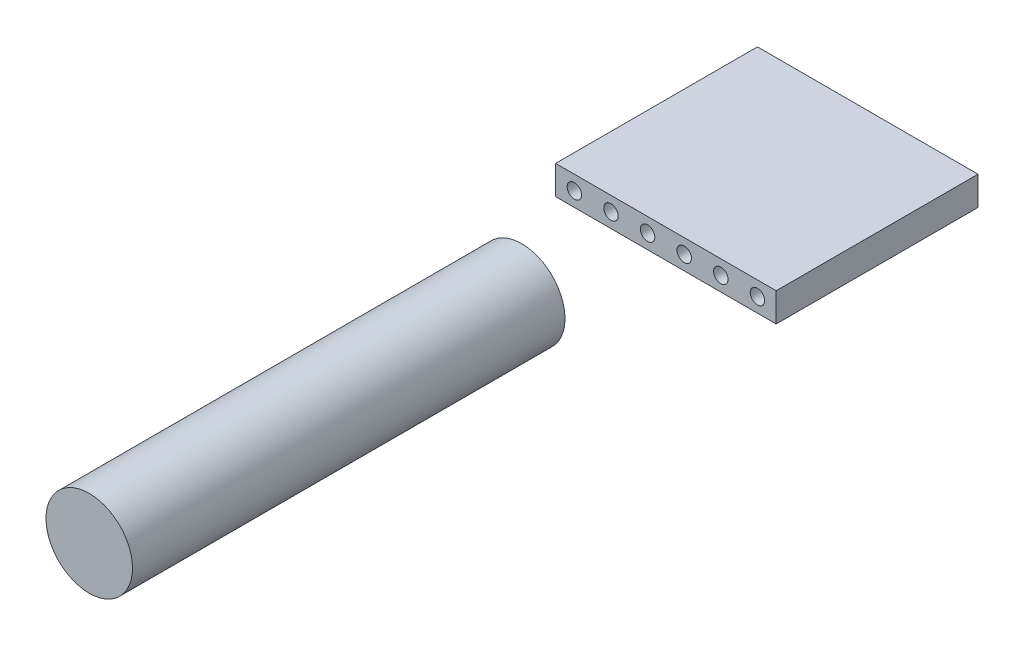
ISO-10303-21;
HEADER;
FILE_DESCRIPTION(('STEP AP214'),'2;1');
FILE_NAME('part.step','',(''),(''),'','','');
FILE_SCHEMA(('AUTOMOTIVE_DESIGN { 1 0 10303 214 1 1 1 1 }'));
ENDSEC;
DATA;
#1=APPLICATION_CONTEXT('core data for automotive mechanical design processes');
#2=APPLICATION_PROTOCOL_DEFINITION('international standard','automotive_design',2000,#1);
#3=PRODUCT_CONTEXT('',#1,'mechanical');
#4=PRODUCT('Part','Part','',(#3));
#5=PRODUCT_RELATED_PRODUCT_CATEGORY('part','',(#4));
#6=PRODUCT_DEFINITION_FORMATION('','',#4);
#7=PRODUCT_DEFINITION_CONTEXT('part definition',#1,'design');
#8=PRODUCT_DEFINITION('design','',#6,#7);
#9=PRODUCT_DEFINITION_SHAPE('','',#8);
#10=(LENGTH_UNIT() NAMED_UNIT(*) SI_UNIT(.MILLI.,.METRE.));
#11=(NAMED_UNIT(*) PLANE_ANGLE_UNIT() SI_UNIT($,.RADIAN.));
#12=(NAMED_UNIT(*) SI_UNIT($,.STERADIAN.) SOLID_ANGLE_UNIT());
#13=UNCERTAINTY_MEASURE_WITH_UNIT(LENGTH_MEASURE(1.E-05),#10,'distance_accuracy_value','');
#14=(GEOMETRIC_REPRESENTATION_CONTEXT(3) GLOBAL_UNCERTAINTY_ASSIGNED_CONTEXT((#13)) GLOBAL_UNIT_ASSIGNED_CONTEXT((#10,
#11,#12)) REPRESENTATION_CONTEXT('',''));
#15=CARTESIAN_POINT('',(0.,0.,0.));
#16=DIRECTION('',(0.,0.,1.));
#17=DIRECTION('',(1.,0.,0.));
#18=AXIS2_PLACEMENT_3D('',#15,#16,#17);
#19=CARTESIAN_POINT('',(0.,0.,14.));
#20=DIRECTION('',(0.,0.,1.));
#21=DIRECTION('',(1.,0.,0.));
#22=AXIS2_PLACEMENT_3D('',#19,#20,#21);
#23=PLANE('',#22);
#24=CARTESIAN_POINT('',(3.84,0.,14.));
#25=DIRECTION('',(0.,0.,1.));
#26=DIRECTION('',(1.,0.,0.));
#27=AXIS2_PLACEMENT_3D('',#24,#25,#26);
#28=CIRCLE('',#27,0.5);
#29=CARTESIAN_POINT('',(4.34,0.,14.));
#30=VERTEX_POINT('',#29);
#31=EDGE_CURVE('E123',#30,#30,#28,.T.);
#32=ORIENTED_EDGE('',*,*,#31,.F.);
#33=EDGE_LOOP('',(#32));
#34=FACE_BOUND('',#33,.T.);
#35=CARTESIAN_POINT('',(11.46,0.,14.));
#36=DIRECTION('',(0.,0.,1.));
#37=DIRECTION('',(1.,0.,0.));
#38=AXIS2_PLACEMENT_3D('',#35,#36,#37);
#39=CIRCLE('',#38,0.499999999999999);
#40=CARTESIAN_POINT('',(11.96,0.,14.));
#41=VERTEX_POINT('',#40);
#42=EDGE_CURVE('E129',#41,#41,#39,.T.);
#43=ORIENTED_EDGE('',*,*,#42,.F.);
#44=EDGE_LOOP('',(#43));
#45=FACE_BOUND('',#44,.T.);
#46=DIRECTION('',(-1.,0.,0.));
#47=VECTOR('',#46,1.);
#48=CARTESIAN_POINT('',(0.,1.,14.));
#49=LINE('',#48,#47);
#50=CARTESIAN_POINT('',(15.3,1.,14.));
#51=VERTEX_POINT('',#50);
#52=CARTESIAN_POINT('',(0.,1.,14.));
#53=VERTEX_POINT('',#52);
#54=EDGE_CURVE('E95',#51,#53,#49,.T.);
#55=ORIENTED_EDGE('',*,*,#54,.T.);
#56=DIRECTION('',(0.,-1.,0.));
#57=VECTOR('',#56,1.);
#58=CARTESIAN_POINT('',(0.,1.,14.));
#59=LINE('',#58,#57);
#60=CARTESIAN_POINT('',(0.,-1.,14.));
#61=VERTEX_POINT('',#60);
#62=EDGE_CURVE('E91',#53,#61,#59,.T.);
#63=ORIENTED_EDGE('',*,*,#62,.T.);
#64=DIRECTION('',(1.,0.,0.));
#65=VECTOR('',#64,1.);
#66=CARTESIAN_POINT('',(0.,-1.,14.));
#67=LINE('',#66,#65);
#68=CARTESIAN_POINT('',(15.3,-1.,14.));
#69=VERTEX_POINT('',#68);
#70=EDGE_CURVE('E84',#61,#69,#67,.T.);
#71=ORIENTED_EDGE('',*,*,#70,.T.);
#72=DIRECTION('',(0.,1.,0.));
#73=VECTOR('',#72,1.);
#74=CARTESIAN_POINT('',(15.3,1.,14.));
#75=LINE('',#74,#73);
#76=EDGE_CURVE('E88',#69,#51,#75,.T.);
#77=ORIENTED_EDGE('',*,*,#76,.T.);
#78=EDGE_LOOP('',(#55,#63,#71,#77));
#79=FACE_BOUND('',#78,.T.);
#80=CARTESIAN_POINT('',(8.92,0.,14.));
#81=DIRECTION('',(0.,0.,-1.));
#82=DIRECTION('',(-1.,0.,0.));
#83=AXIS2_PLACEMENT_3D('',#80,#81,#82);
#84=CIRCLE('',#83,0.499999999999999);
#85=CARTESIAN_POINT('',(8.42,0.,14.));
#86=VERTEX_POINT('',#85);
#87=EDGE_CURVE('E49',#86,#86,#84,.T.);
#88=ORIENTED_EDGE('',*,*,#87,.T.);
#89=EDGE_LOOP('',(#88));
#90=FACE_BOUND('',#89,.T.);
#91=CARTESIAN_POINT('',(6.38,0.,14.));
#92=DIRECTION('',(0.,0.,-1.));
#93=DIRECTION('',(-1.,0.,0.));
#94=AXIS2_PLACEMENT_3D('',#91,#92,#93);
#95=CIRCLE('',#94,0.5);
#96=CARTESIAN_POINT('',(5.88,0.,14.));
#97=VERTEX_POINT('',#96);
#98=EDGE_CURVE('E12',#97,#97,#95,.T.);
#99=ORIENTED_EDGE('',*,*,#98,.T.);
#100=EDGE_LOOP('',(#99));
#101=FACE_BOUND('',#100,.T.);
#102=CARTESIAN_POINT('',(14.,0.,14.));
#103=DIRECTION('',(0.,0.,1.));
#104=DIRECTION('',(1.,0.,0.));
#105=AXIS2_PLACEMENT_3D('',#102,#103,#104);
#106=CIRCLE('',#105,0.499999999999999);
#107=CARTESIAN_POINT('',(14.5,0.,14.));
#108=VERTEX_POINT('',#107);
#109=EDGE_CURVE('E137',#108,#108,#106,.T.);
#110=ORIENTED_EDGE('',*,*,#109,.F.);
#111=EDGE_LOOP('',(#110));
#112=FACE_BOUND('',#111,.T.);
#113=CARTESIAN_POINT('',(1.3,0.,14.));
#114=DIRECTION('',(0.,0.,1.));
#115=DIRECTION('',(1.,0.,0.));
#116=AXIS2_PLACEMENT_3D('',#113,#114,#115);
#117=CIRCLE('',#116,0.5);
#118=CARTESIAN_POINT('',(1.8,0.,14.));
#119=VERTEX_POINT('',#118);
#120=EDGE_CURVE('E120',#119,#119,#117,.T.);
#121=ORIENTED_EDGE('',*,*,#120,.F.);
#122=EDGE_LOOP('',(#121));
#123=FACE_BOUND('',#122,.T.);
#124=ADVANCED_FACE('F45',(#34,#45,#79,#90,#101,#112,#123),#23,.T.);
#125=CARTESIAN_POINT('',(0.,0.,0.));
#126=DIRECTION('',(0.,0.,1.));
#127=DIRECTION('',(1.,0.,0.));
#128=AXIS2_PLACEMENT_3D('',#125,#126,#127);
#129=PLANE('',#128);
#130=CARTESIAN_POINT('',(11.46,0.,0.));
#131=DIRECTION('',(0.,0.,1.));
#132=DIRECTION('',(1.,0.,0.));
#133=AXIS2_PLACEMENT_3D('',#130,#131,#132);
#134=CIRCLE('',#133,0.499999999999999);
#135=CARTESIAN_POINT('',(11.96,0.,0.));
#136=VERTEX_POINT('',#135);
#137=EDGE_CURVE('E107',#136,#136,#134,.T.);
#138=ORIENTED_EDGE('',*,*,#137,.T.);
#139=EDGE_LOOP('',(#138));
#140=FACE_BOUND('',#139,.T.);
#141=CARTESIAN_POINT('',(6.38,0.,0.));
#142=DIRECTION('',(0.,0.,1.));
#143=DIRECTION('',(1.,0.,0.));
#144=AXIS2_PLACEMENT_3D('',#141,#142,#143);
#145=CIRCLE('',#144,0.5);
#146=CARTESIAN_POINT('',(6.88,0.,0.));
#147=VERTEX_POINT('',#146);
#148=EDGE_CURVE('E110',#147,#147,#145,.T.);
#149=ORIENTED_EDGE('',*,*,#148,.T.);
#150=EDGE_LOOP('',(#149));
#151=FACE_BOUND('',#150,.T.);
#152=CARTESIAN_POINT('',(1.3,0.,0.));
#153=DIRECTION('',(0.,0.,1.));
#154=DIRECTION('',(1.,0.,0.));
#155=AXIS2_PLACEMENT_3D('',#152,#153,#154);
#156=CIRCLE('',#155,0.5);
#157=CARTESIAN_POINT('',(1.8,0.,0.));
#158=VERTEX_POINT('',#157);
#159=EDGE_CURVE('E116',#158,#158,#156,.T.);
#160=ORIENTED_EDGE('',*,*,#159,.T.);
#161=EDGE_LOOP('',(#160));
#162=FACE_BOUND('',#161,.T.);
#163=DIRECTION('',(0.,-1.,0.));
#164=VECTOR('',#163,1.);
#165=CARTESIAN_POINT('',(0.,1.,0.));
#166=LINE('',#165,#164);
#167=CARTESIAN_POINT('',(0.,1.,0.));
#168=VERTEX_POINT('',#167);
#169=CARTESIAN_POINT('',(0.,-1.,0.));
#170=VERTEX_POINT('',#169);
#171=EDGE_CURVE('E140',#168,#170,#166,.T.);
#172=ORIENTED_EDGE('',*,*,#171,.F.);
#173=DIRECTION('',(-1.,0.,0.));
#174=VECTOR('',#173,1.);
#175=CARTESIAN_POINT('',(0.,1.,0.));
#176=LINE('',#175,#174);
#177=CARTESIAN_POINT('',(15.3,1.,0.));
#178=VERTEX_POINT('',#177);
#179=EDGE_CURVE('E62',#178,#168,#176,.T.);
#180=ORIENTED_EDGE('',*,*,#179,.F.);
#181=DIRECTION('',(0.,1.,0.));
#182=VECTOR('',#181,1.);
#183=CARTESIAN_POINT('',(15.3,1.,0.));
#184=LINE('',#183,#182);
#185=CARTESIAN_POINT('',(15.3,-1.,0.));
#186=VERTEX_POINT('',#185);
#187=EDGE_CURVE('E103',#186,#178,#184,.T.);
#188=ORIENTED_EDGE('',*,*,#187,.F.);
#189=DIRECTION('',(1.,0.,0.));
#190=VECTOR('',#189,1.);
#191=CARTESIAN_POINT('',(0.,-1.,0.));
#192=LINE('',#191,#190);
#193=EDGE_CURVE('E100',#170,#186,#192,.T.);
#194=ORIENTED_EDGE('',*,*,#193,.F.);
#195=EDGE_LOOP('',(#172,#180,#188,#194));
#196=FACE_BOUND('',#195,.T.);
#197=CARTESIAN_POINT('',(3.84,0.,0.));
#198=DIRECTION('',(0.,0.,1.));
#199=DIRECTION('',(1.,0.,0.));
#200=AXIS2_PLACEMENT_3D('',#197,#198,#199);
#201=CIRCLE('',#200,0.5);
#202=CARTESIAN_POINT('',(4.34,0.,0.));
#203=VERTEX_POINT('',#202);
#204=EDGE_CURVE('E119',#203,#203,#201,.T.);
#205=ORIENTED_EDGE('',*,*,#204,.T.);
#206=EDGE_LOOP('',(#205));
#207=FACE_BOUND('',#206,.T.);
#208=CARTESIAN_POINT('',(8.92,0.,0.));
#209=DIRECTION('',(0.,0.,1.));
#210=DIRECTION('',(1.,0.,0.));
#211=AXIS2_PLACEMENT_3D('',#208,#209,#210);
#212=CIRCLE('',#211,0.499999999999999);
#213=CARTESIAN_POINT('',(9.42,0.,0.));
#214=VERTEX_POINT('',#213);
#215=EDGE_CURVE('E126',#214,#214,#212,.T.);
#216=ORIENTED_EDGE('',*,*,#215,.T.);
#217=EDGE_LOOP('',(#216));
#218=FACE_BOUND('',#217,.T.);
#219=CARTESIAN_POINT('',(14.,0.,0.));
#220=DIRECTION('',(0.,0.,1.));
#221=DIRECTION('',(1.,0.,0.));
#222=AXIS2_PLACEMENT_3D('',#219,#220,#221);
#223=CIRCLE('',#222,0.499999999999999);
#224=CARTESIAN_POINT('',(14.5,0.,0.));
#225=VERTEX_POINT('',#224);
#226=EDGE_CURVE('E133',#225,#225,#223,.T.);
#227=ORIENTED_EDGE('',*,*,#226,.T.);
#228=EDGE_LOOP('',(#227));
#229=FACE_BOUND('',#228,.T.);
#230=ADVANCED_FACE('F156',(#140,#151,#162,#196,#207,#218,#229),#129,.F.);
#231=CARTESIAN_POINT('',(0.,1.,14.));
#232=DIRECTION('',(1.,0.,0.));
#233=DIRECTION('',(0.,1.,0.));
#234=AXIS2_PLACEMENT_3D('',#231,#232,#233);
#235=PLANE('',#234);
#236=ORIENTED_EDGE('',*,*,#171,.T.);
#237=DIRECTION('',(0.,0.,-1.));
#238=VECTOR('',#237,1.);
#239=CARTESIAN_POINT('',(0.,-1.,14.));
#240=LINE('',#239,#238);
#241=EDGE_CURVE('E208',#61,#170,#240,.T.);
#242=ORIENTED_EDGE('',*,*,#241,.F.);
#243=ORIENTED_EDGE('',*,*,#62,.F.);
#244=DIRECTION('',(0.,0.,-1.));
#245=VECTOR('',#244,1.);
#246=CARTESIAN_POINT('',(0.,1.,14.));
#247=LINE('',#246,#245);
#248=EDGE_CURVE('E204',#53,#168,#247,.T.);
#249=ORIENTED_EDGE('',*,*,#248,.T.);
#250=EDGE_LOOP('',(#236,#242,#243,#249));
#251=FACE_BOUND('',#250,.T.);
#252=ADVANCED_FACE('F159',(#251),#235,.F.);
#253=CARTESIAN_POINT('',(0.,-1.,14.));
#254=DIRECTION('',(0.,1.,0.));
#255=DIRECTION('',(0.,0.,1.));
#256=AXIS2_PLACEMENT_3D('',#253,#254,#255);
#257=PLANE('',#256);
#258=ORIENTED_EDGE('',*,*,#193,.T.);
#259=DIRECTION('',(0.,0.,-1.));
#260=VECTOR('',#259,1.);
#261=CARTESIAN_POINT('',(15.3,-1.,14.));
#262=LINE('',#261,#260);
#263=EDGE_CURVE('E98',#69,#186,#262,.T.);
#264=ORIENTED_EDGE('',*,*,#263,.F.);
#265=ORIENTED_EDGE('',*,*,#70,.F.);
#266=ORIENTED_EDGE('',*,*,#241,.T.);
#267=EDGE_LOOP('',(#258,#264,#265,#266));
#268=FACE_BOUND('',#267,.T.);
#269=ADVANCED_FACE('F99',(#268),#257,.F.);
#270=CARTESIAN_POINT('',(15.3,1.,14.));
#271=DIRECTION('',(-1.,0.,0.));
#272=DIRECTION('',(0.,0.,1.));
#273=AXIS2_PLACEMENT_3D('',#270,#271,#272);
#274=PLANE('',#273);
#275=ORIENTED_EDGE('',*,*,#187,.T.);
#276=DIRECTION('',(0.,0.,-1.));
#277=VECTOR('',#276,1.);
#278=CARTESIAN_POINT('',(15.3,1.,14.));
#279=LINE('',#278,#277);
#280=EDGE_CURVE('E106',#51,#178,#279,.T.);
#281=ORIENTED_EDGE('',*,*,#280,.F.);
#282=ORIENTED_EDGE('',*,*,#76,.F.);
#283=ORIENTED_EDGE('',*,*,#263,.T.);
#284=EDGE_LOOP('',(#275,#281,#282,#283));
#285=FACE_BOUND('',#284,.T.);
#286=ADVANCED_FACE('F105',(#285),#274,.F.);
#287=CARTESIAN_POINT('',(0.,1.,14.));
#288=DIRECTION('',(0.,-1.,0.));
#289=DIRECTION('',(0.,0.,-1.));
#290=AXIS2_PLACEMENT_3D('',#287,#288,#289);
#291=PLANE('',#290);
#292=ORIENTED_EDGE('',*,*,#179,.T.);
#293=ORIENTED_EDGE('',*,*,#248,.F.);
#294=ORIENTED_EDGE('',*,*,#54,.F.);
#295=ORIENTED_EDGE('',*,*,#280,.T.);
#296=EDGE_LOOP('',(#292,#293,#294,#295));
#297=FACE_BOUND('',#296,.T.);
#298=ADVANCED_FACE('F182',(#297),#291,.F.);
#299=CARTESIAN_POINT('',(1.3,0.,14.));
#300=DIRECTION('',(0.,0.,-1.));
#301=DIRECTION('',(-1.,0.,0.));
#302=AXIS2_PLACEMENT_3D('',#299,#300,#301);
#303=CYLINDRICAL_SURFACE('',#302,0.5);
#304=ORIENTED_EDGE('',*,*,#120,.T.);
#305=EDGE_LOOP('',(#304));
#306=FACE_BOUND('',#305,.T.);
#307=ORIENTED_EDGE('',*,*,#159,.F.);
#308=EDGE_LOOP('',(#307));
#309=FACE_BOUND('',#308,.T.);
#310=ADVANCED_FACE('F178',(#306,#309),#303,.F.);
#311=CARTESIAN_POINT('',(3.84,0.,14.));
#312=DIRECTION('',(0.,0.,-1.));
#313=DIRECTION('',(-1.,0.,0.));
#314=AXIS2_PLACEMENT_3D('',#311,#312,#313);
#315=CYLINDRICAL_SURFACE('',#314,0.5);
#316=ORIENTED_EDGE('',*,*,#31,.T.);
#317=EDGE_LOOP('',(#316));
#318=FACE_BOUND('',#317,.T.);
#319=ORIENTED_EDGE('',*,*,#204,.F.);
#320=EDGE_LOOP('',(#319));
#321=FACE_BOUND('',#320,.T.);
#322=ADVANCED_FACE('F181',(#318,#321),#315,.F.);
#323=CARTESIAN_POINT('',(6.38,0.,14.));
#324=DIRECTION('',(0.,0.,-1.));
#325=DIRECTION('',(-1.,0.,0.));
#326=AXIS2_PLACEMENT_3D('',#323,#324,#325);
#327=CYLINDRICAL_SURFACE('',#326,0.5);
#328=ORIENTED_EDGE('',*,*,#98,.F.);
#329=EDGE_LOOP('',(#328));
#330=FACE_BOUND('',#329,.T.);
#331=ORIENTED_EDGE('',*,*,#148,.F.);
#332=EDGE_LOOP('',(#331));
#333=FACE_BOUND('',#332,.T.);
#334=ADVANCED_FACE('F152',(#330,#333),#327,.F.);
#335=CARTESIAN_POINT('',(8.92,0.,14.));
#336=DIRECTION('',(0.,0.,-1.));
#337=DIRECTION('',(-1.,0.,0.));
#338=AXIS2_PLACEMENT_3D('',#335,#336,#337);
#339=CYLINDRICAL_SURFACE('',#338,0.499999999999999);
#340=ORIENTED_EDGE('',*,*,#87,.F.);
#341=EDGE_LOOP('',(#340));
#342=FACE_BOUND('',#341,.T.);
#343=ORIENTED_EDGE('',*,*,#215,.F.);
#344=EDGE_LOOP('',(#343));
#345=FACE_BOUND('',#344,.T.);
#346=ADVANCED_FACE('F148',(#342,#345),#339,.F.);
#347=CARTESIAN_POINT('',(11.46,0.,14.));
#348=DIRECTION('',(0.,0.,-1.));
#349=DIRECTION('',(-1.,0.,0.));
#350=AXIS2_PLACEMENT_3D('',#347,#348,#349);
#351=CYLINDRICAL_SURFACE('',#350,0.499999999999999);
#352=ORIENTED_EDGE('',*,*,#42,.T.);
#353=EDGE_LOOP('',(#352));
#354=FACE_BOUND('',#353,.T.);
#355=ORIENTED_EDGE('',*,*,#137,.F.);
#356=EDGE_LOOP('',(#355));
#357=FACE_BOUND('',#356,.T.);
#358=ADVANCED_FACE('F151',(#354,#357),#351,.F.);
#359=CARTESIAN_POINT('',(14.,0.,14.));
#360=DIRECTION('',(0.,0.,-1.));
#361=DIRECTION('',(-1.,0.,0.));
#362=AXIS2_PLACEMENT_3D('',#359,#360,#361);
#363=CYLINDRICAL_SURFACE('',#362,0.499999999999999);
#364=ORIENTED_EDGE('',*,*,#109,.T.);
#365=EDGE_LOOP('',(#364));
#366=FACE_BOUND('',#365,.T.);
#367=ORIENTED_EDGE('',*,*,#226,.F.);
#368=EDGE_LOOP('',(#367));
#369=FACE_BOUND('',#368,.T.);
#370=ADVANCED_FACE('F47',(#366,#369),#363,.F.);
#371=CLOSED_SHELL('',(#124,#230,#252,#269,#286,#298,#310,#322,#334,#346,#358,#370));
#372=MANIFOLD_SOLID_BREP('B2',#371);
#373=CARTESIAN_POINT('',(7.65,2.,54.));
#374=DIRECTION('',(0.,0.,1.));
#375=DIRECTION('',(1.,0.,0.));
#376=AXIS2_PLACEMENT_3D('',#373,#374,#375);
#377=PLANE('',#376);
#378=CARTESIAN_POINT('',(7.65,2.,54.));
#379=DIRECTION('',(0.,0.,1.));
#380=DIRECTION('',(1.,0.,0.));
#381=AXIS2_PLACEMENT_3D('',#378,#379,#380);
#382=CIRCLE('',#381,3.);
#383=CARTESIAN_POINT('',(10.65,2.,54.));
#384=VERTEX_POINT('',#383);
#385=EDGE_CURVE('E44',#384,#384,#382,.T.);
#386=ORIENTED_EDGE('',*,*,#385,.T.);
#387=EDGE_LOOP('',(#386));
#388=FACE_BOUND('',#387,.T.);
#389=ADVANCED_FACE('F298',(#388),#377,.T.);
#390=CARTESIAN_POINT('',(7.65,2.,54.));
#391=DIRECTION('',(0.,0.,-1.));
#392=DIRECTION('',(-1.,0.,0.));
#393=AXIS2_PLACEMENT_3D('',#390,#391,#392);
#394=CYLINDRICAL_SURFACE('',#393,3.);
#395=ORIENTED_EDGE('',*,*,#385,.F.);
#396=EDGE_LOOP('',(#395));
#397=FACE_BOUND('',#396,.T.);
#398=CARTESIAN_POINT('',(7.65,2.,24.));
#399=DIRECTION('',(0.,0.,-1.));
#400=DIRECTION('',(-1.,0.,0.));
#401=AXIS2_PLACEMENT_3D('',#398,#399,#400);
#402=CIRCLE('',#401,3.);
#403=CARTESIAN_POINT('',(4.65,2.,24.));
#404=VERTEX_POINT('',#403);
#405=EDGE_CURVE('E302',#404,#404,#402,.T.);
#406=ORIENTED_EDGE('',*,*,#405,.F.);
#407=EDGE_LOOP('',(#406));
#408=FACE_BOUND('',#407,.T.);
#409=ADVANCED_FACE('F300',(#397,#408),#394,.T.);
#410=CARTESIAN_POINT('',(7.65,2.,24.));
#411=DIRECTION('',(0.,0.,-1.));
#412=DIRECTION('',(-1.,0.,0.));
#413=AXIS2_PLACEMENT_3D('',#410,#411,#412);
#414=PLANE('',#413);
#415=ORIENTED_EDGE('',*,*,#405,.T.);
#416=EDGE_LOOP('',(#415));
#417=FACE_BOUND('',#416,.T.);
#418=ADVANCED_FACE('F311',(#417),#414,.T.);
#419=CLOSED_SHELL('',(#389,#409,#418));
#420=MANIFOLD_SOLID_BREP('B6',#419);
#421=ADVANCED_BREP_SHAPE_REPRESENTATION('',(#18,#372,#420),#14);
#422=SHAPE_DEFINITION_REPRESENTATION(#9,#421);
ENDSEC;
END-ISO-10303-21;
